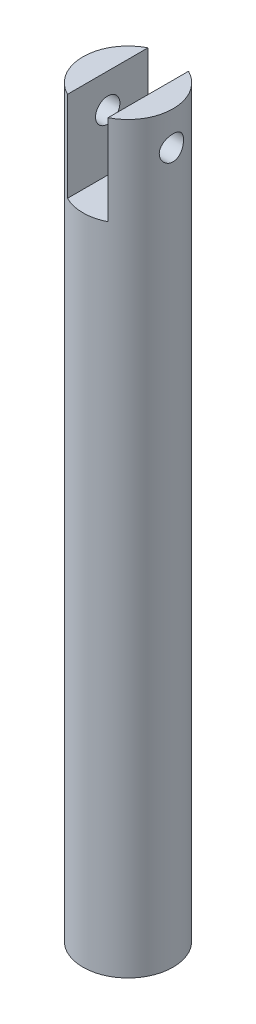
ISO-10303-21;
HEADER;
FILE_DESCRIPTION(('STEP AP214'),'2;1');
FILE_NAME('part.step','',(''),(''),'','','');
FILE_SCHEMA(('AUTOMOTIVE_DESIGN { 1 0 10303 214 1 1 1 1 }'));
ENDSEC;
DATA;
#1=APPLICATION_CONTEXT('core data for automotive mechanical design processes');
#2=APPLICATION_PROTOCOL_DEFINITION('international standard','automotive_design',2000,#1);
#3=PRODUCT_CONTEXT('',#1,'mechanical');
#4=PRODUCT('Part','Part','',(#3));
#5=PRODUCT_RELATED_PRODUCT_CATEGORY('part','',(#4));
#6=PRODUCT_DEFINITION_FORMATION('','',#4);
#7=PRODUCT_DEFINITION_CONTEXT('part definition',#1,'design');
#8=PRODUCT_DEFINITION('design','',#6,#7);
#9=PRODUCT_DEFINITION_SHAPE('','',#8);
#10=(LENGTH_UNIT() NAMED_UNIT(*) SI_UNIT(.MILLI.,.METRE.));
#11=(NAMED_UNIT(*) PLANE_ANGLE_UNIT() SI_UNIT($,.RADIAN.));
#12=(NAMED_UNIT(*) SI_UNIT($,.STERADIAN.) SOLID_ANGLE_UNIT());
#13=UNCERTAINTY_MEASURE_WITH_UNIT(LENGTH_MEASURE(1.E-05),#10,'distance_accuracy_value','');
#14=(GEOMETRIC_REPRESENTATION_CONTEXT(3) GLOBAL_UNCERTAINTY_ASSIGNED_CONTEXT((#13)) GLOBAL_UNIT_ASSIGNED_CONTEXT((#10,
#11,#12)) REPRESENTATION_CONTEXT('',''));
#15=CARTESIAN_POINT('',(0.,0.,0.));
#16=DIRECTION('',(0.,0.,1.));
#17=DIRECTION('',(1.,0.,0.));
#18=AXIS2_PLACEMENT_3D('',#15,#16,#17);
#19=CARTESIAN_POINT('',(0.,165.,0.));
#20=DIRECTION('',(0.,1.,0.));
#21=DIRECTION('',(0.,0.,1.));
#22=AXIS2_PLACEMENT_3D('',#19,#20,#21);
#23=PLANE('',#22);
#24=DIRECTION('',(0.,0.,-1.));
#25=VECTOR('',#24,1.);
#26=CARTESIAN_POINT('',(4.5,165.,0.));
#27=LINE('',#26,#25);
#28=CARTESIAN_POINT('',(4.5,165.,8.93028554974588));
#29=VERTEX_POINT('',#28);
#30=CARTESIAN_POINT('',(4.5,165.,-8.93028554974588));
#31=VERTEX_POINT('',#30);
#32=EDGE_CURVE('E68',#29,#31,#27,.T.);
#33=ORIENTED_EDGE('',*,*,#32,.F.);
#34=CARTESIAN_POINT('',(0.,165.,0.));
#35=DIRECTION('',(0.,1.,0.));
#36=DIRECTION('',(0.,0.,1.));
#37=AXIS2_PLACEMENT_3D('',#34,#35,#36);
#38=CIRCLE('',#37,10.);
#39=EDGE_CURVE('E124',#29,#31,#38,.T.);
#40=ORIENTED_EDGE('',*,*,#39,.T.);
#41=EDGE_LOOP('',(#33,#40));
#42=FACE_BOUND('',#41,.T.);
#43=ADVANCED_FACE('F38',(#42),#23,.T.);
#44=CARTESIAN_POINT('',(0.,165.,0.));
#45=DIRECTION('',(0.,-1.,0.));
#46=DIRECTION('',(0.,0.,-1.));
#47=AXIS2_PLACEMENT_3D('',#44,#45,#46);
#48=CYLINDRICAL_SURFACE('',#47,10.);
#49=CARTESIAN_POINT('',(-10.,154.8,0.));
#50=CARTESIAN_POINT('',(-9.99999782711062,154.800003386559,-0.148774661539189));
#51=CARTESIAN_POINT('',(-9.9966473286939,154.812337799472,-0.297585333539505));
#52=CARTESIAN_POINT('',(-9.9836070871437,154.861259427152,-0.590915377352122));
#53=CARTESIAN_POINT('',(-9.97391440506767,154.897857885885,-0.735432727183114));
#54=CARTESIAN_POINT('',(-9.94925888075004,154.99402760759,-1.0158999716253));
#55=CARTESIAN_POINT('',(-9.93430293083146,155.053568836318,-1.15186079795327));
#56=CARTESIAN_POINT('',(-9.90069893619965,155.193821453031,-1.41186713995326));
#57=CARTESIAN_POINT('',(-9.88205062098072,155.274534392213,-1.53591178164642));
#58=CARTESIAN_POINT('',(-9.84257839340819,155.456860153675,-1.77150674574477));
#59=CARTESIAN_POINT('',(-9.82171656406306,155.558881996826,-1.88273418059792));
#60=CARTESIAN_POINT('',(-9.78041033750172,155.78005544482,-2.08672685900315));
#61=CARTESIAN_POINT('',(-9.75996599578902,155.899209310591,-2.17948966190395));
#62=CARTESIAN_POINT('',(-9.72142045038815,156.153856412825,-2.34550594040794));
#63=CARTESIAN_POINT('',(-9.70336702035334,156.28960111161,-2.41838581893268));
#64=CARTESIAN_POINT('',(-9.67220575557493,156.571983500368,-2.54016030192197));
#65=CARTESIAN_POINT('',(-9.65909698346571,156.718619119419,-2.58905945297415));
#66=CARTESIAN_POINT('',(-9.6397010807165,157.015039944227,-2.66035893311824));
#67=CARTESIAN_POINT('',(-9.63326327331372,157.164674001672,-2.68334564996611));
#68=CARTESIAN_POINT('',(-9.6274882093643,157.465802406783,-2.70399621024263));
#69=CARTESIAN_POINT('',(-9.62814958985618,157.617296391786,-2.70166491443413));
#70=CARTESIAN_POINT('',(-9.63636343910677,157.913249730162,-2.67221068345233));
#71=CARTESIAN_POINT('',(-9.64371802942124,158.057786298388,-2.64579960378853));
#72=CARTESIAN_POINT('',(-9.66417246956971,158.340296488011,-2.57007659520705));
#73=CARTESIAN_POINT('',(-9.67727278885834,158.478269572117,-2.52076279500381));
#74=CARTESIAN_POINT('',(-9.70791505301908,158.745580817203,-2.40005953075999));
#75=CARTESIAN_POINT('',(-9.72550642491525,158.874801198981,-2.32842230940989));
#76=CARTESIAN_POINT('',(-9.76312239105775,159.119635831906,-2.16527848967669));
#77=CARTESIAN_POINT('',(-9.78314747476023,159.235247336868,-2.073767891536));
#78=CARTESIAN_POINT('',(-9.82419621962814,159.453646872194,-1.86984509586577));
#79=CARTESIAN_POINT('',(-9.84523086847348,159.555876080505,-1.7568357583884));
#80=CARTESIAN_POINT('',(-9.88532822784153,159.740047830832,-1.51501964000974));
#81=CARTESIAN_POINT('',(-9.90439085671031,159.821989533014,-1.38621220545104));
#82=CARTESIAN_POINT('',(-9.93851852041525,159.963514913375,-1.11557667636108));
#83=CARTESIAN_POINT('',(-9.95356499679829,160.022995305973,-0.973692076178258));
#84=CARTESIAN_POINT('',(-9.97783097942399,160.11709667255,-0.681437664338064));
#85=CARTESIAN_POINT('',(-9.98705179200694,160.151723219964,-0.531069763210365));
#86=CARTESIAN_POINT('',(-9.99842908447533,160.194251550347,-0.230884458265844));
#87=CARTESIAN_POINT('',(-10.000786274626,160.202912855267,-0.0811821027812173));
#88=CARTESIAN_POINT('',(-9.99874890418695,160.19536533025,0.21753690753403));
#89=CARTESIAN_POINT('',(-9.99435506036759,160.179159140544,0.366553633474505));
#90=CARTESIAN_POINT('',(-9.97943914885916,160.122958910074,0.656945682429493));
#91=CARTESIAN_POINT('',(-9.96902678125841,160.0833904254,0.798409517758602));
#92=CARTESIAN_POINT('',(-9.94325681392839,159.982084672722,1.07267627177578));
#93=CARTESIAN_POINT('',(-9.92789867156819,159.920344972094,1.20547823819418));
#94=CARTESIAN_POINT('',(-9.89347275386225,159.775053471939,1.46158793695578));
#95=CARTESIAN_POINT('',(-9.87433707216918,159.691091020193,1.5846533476921));
#96=CARTESIAN_POINT('',(-9.8345670726555,159.504251943255,1.81521391773308));
#97=CARTESIAN_POINT('',(-9.81393245162483,159.401371484791,1.92270591355773));
#98=CARTESIAN_POINT('',(-9.77274857958053,159.176069273472,2.12228305583065));
#99=CARTESIAN_POINT('',(-9.75221911203505,159.053167832728,2.2138317792438));
#100=CARTESIAN_POINT('',(-9.71422484892846,158.793310777353,2.37501987696983));
#101=CARTESIAN_POINT('',(-9.69675992824167,158.656355736893,2.44466014589861));
#102=CARTESIAN_POINT('',(-9.66707405627601,158.372946507826,2.55953142390198));
#103=CARTESIAN_POINT('',(-9.65482314679195,158.226552309027,2.60490227588316));
#104=CARTESIAN_POINT('',(-9.63695190227225,157.927823956503,2.67026743177152));
#105=CARTESIAN_POINT('',(-9.63132982056536,157.775491378452,2.69026842064778));
#106=CARTESIAN_POINT('',(-9.62750126828841,157.47470959402,2.70393453870695));
#107=CARTESIAN_POINT('',(-9.62905171428235,157.326302124101,2.69846291707097));
#108=CARTESIAN_POINT('',(-9.63882292855891,157.032610321882,2.663347108296));
#109=CARTESIAN_POINT('',(-9.64704351692299,156.88732590545,2.63370357316333));
#110=CARTESIAN_POINT('',(-9.66908223320172,156.605121496191,2.55159164235858));
#111=CARTESIAN_POINT('',(-9.68285437420306,156.468143170952,2.49931051009792));
#112=CARTESIAN_POINT('',(-9.7144445233644,156.204797630981,2.37355266173573));
#113=CARTESIAN_POINT('',(-9.7322631805526,156.078432122915,2.3000725449782));
#114=CARTESIAN_POINT('',(-9.77060877503339,155.83578947374,2.13140472742221));
#115=CARTESIAN_POINT('',(-9.79120110383606,155.719930655762,2.03563003127804));
#116=CARTESIAN_POINT('',(-9.83241350585107,155.505648810985,1.82620238877443));
#117=CARTESIAN_POINT('',(-9.85303358461553,155.407230053806,1.71254507727064));
#118=CARTESIAN_POINT('',(-9.89252319212526,155.228481134855,1.46754832216847));
#119=CARTESIAN_POINT('',(-9.9113439693372,155.148598743481,1.33587364656039));
#120=CARTESIAN_POINT('',(-9.94457675907837,155.012229021564,1.06045940918334));
#121=CARTESIAN_POINT('',(-9.95899152875418,154.955727052393,0.916727464560686));
#122=CARTESIAN_POINT('',(-9.97998045270278,154.87487709051,0.644659805995571));
#123=CARTESIAN_POINT('',(-9.98743240312409,154.846864379331,0.517468948295389));
#124=CARTESIAN_POINT('',(-9.99744287196379,154.809425321613,0.260194372540813));
#125=CARTESIAN_POINT('',(-10.0000019003015,154.799997038283,0.130110957365908));
#126=CARTESIAN_POINT('',(-10.,154.8,0.));
#127=B_SPLINE_CURVE_WITH_KNOTS('',3,(#49,#50,#51,#52,#53,#54,#55,#56,#57,#58,#59,#60,#61,#62,
#63,#64,#65,#66,#67,#68,#69,#70,#71,#72,#73,#74,#75,#76,#77,#78,#79,#80,#81,#82,#83,#84,#85,#86,
#87,#88,#89,#90,#91,#92,#93,#94,#95,#96,#97,#98,#99,#100,#101,#102,#103,#104,#105,#106,#107,
#108,#109,#110,#111,#112,#113,#114,#115,#116,#117,#118,#119,#120,#121,#122,#123,#124,#125,#126),
.UNSPECIFIED.,.T.,.F.,(4,2,2,2,2,2,2,2,2,2,2,2,2,2,2,2,2,2,2,2,2,2,2,2,2,2,2,2,2,2,2,2,2,2,2,2,
2,2,4),(0.,0.4458467616671,0.89190027339732,1.33737183210164,1.78287603849987,2.23788152875124,
2.69294712165628,3.15605180718671,3.61906865714873,4.07138297844436,4.52361046220639,
4.96288777079235,5.40220097720712,5.84657486439829,6.2910382702339,6.75038019248415,
7.20974112674612,7.67118937307156,8.13253410800253,8.58024533675495,9.02790903442276,
9.46765948757283,9.90745820485944,10.3560325750265,10.8046979382342,11.2663584986383,
11.7280002050195,12.1869524199219,12.6457836755925,13.089180858158,13.5325660810499,
13.9723515673493,14.4122076415362,14.8653077300239,15.3185185922744,15.7817442781461,
16.2446794950919,16.6346356533841,17.0245511699031),.UNSPECIFIED.);
#128=CARTESIAN_POINT('',(-10.,154.8,0.));
#129=VERTEX_POINT('',#128);
#130=EDGE_CURVE('E101',#129,#129,#127,.T.);
#131=ORIENTED_EDGE('',*,*,#130,.T.);
#132=EDGE_LOOP('',(#131));
#133=FACE_BOUND('',#132,.T.);
#134=CARTESIAN_POINT('',(9.62860322165162,157.5,-2.70000000000001));
#135=CARTESIAN_POINT('',(9.6286057280429,157.351336835201,-2.69999655900299));
#136=CARTESIAN_POINT('',(9.63208384696354,157.202637558112,-2.68767998648855));
#137=CARTESIAN_POINT('',(9.64557761207292,156.909538490372,-2.63883563352605));
#138=CARTESIAN_POINT('',(9.65559643086276,156.765140821798,-2.60229610347128));
#139=CARTESIAN_POINT('',(9.6809560194939,156.484927566899,-2.50629855598375));
#140=CARTESIAN_POINT('',(9.69628917493481,156.349100028633,-2.4468733158087));
#141=CARTESIAN_POINT('',(9.73054001291658,156.089319932487,-2.30689442210335));
#142=CARTESIAN_POINT('',(9.74945799945857,155.965368383058,-2.22633897646498));
#143=CARTESIAN_POINT('',(9.78929049159682,155.729680691704,-2.04417749563688));
#144=CARTESIAN_POINT('',(9.81024110105091,155.618294133831,-1.94212695493154));
#145=CARTESIAN_POINT('',(9.85146692605695,155.41399083801,-1.720827788983));
#146=CARTESIAN_POINT('',(9.87174206990631,155.321076055724,-1.60157734503675));
#147=CARTESIAN_POINT('',(9.90973607193501,155.154890362593,-1.34683342478799));
#148=CARTESIAN_POINT('',(9.92740737783171,155.081967841189,-1.21110496320858));
#149=CARTESIAN_POINT('',(9.95778787784737,154.960110180409,-0.928757102408092));
#150=CARTESIAN_POINT('',(9.97049793048538,154.911170890484,-0.782139592711362));
#151=CARTESIAN_POINT('',(9.98926854149535,154.839802725142,-0.485825353649318));
#152=CARTESIAN_POINT('',(9.99547806856363,154.816778982952,-0.336281502296952));
#153=CARTESIAN_POINT('',(10.0010691903509,154.796023018522,-0.0353335236431608));
#154=CARTESIAN_POINT('',(10.0004519555091,154.798286460829,0.116070280325717));
#155=CARTESIAN_POINT('',(9.9925678836156,154.827623566266,0.412296758741117));
#156=CARTESIAN_POINT('',(9.98547334585882,154.854054392749,0.557188384959518));
#157=CARTESIAN_POINT('',(9.96563570475151,154.929936371642,0.84039798252662));
#158=CARTESIAN_POINT('',(9.9528922753063,154.979388853036,0.978715573864246));
#159=CARTESIAN_POINT('',(9.92293481218154,155.100397485281,1.24648099930841));
#160=CARTESIAN_POINT('',(9.90567686412702,155.172172145261,1.3758249695454));
#161=CARTESIAN_POINT('',(9.86854715172272,155.335619553651,1.62085061906021));
#162=CARTESIAN_POINT('',(9.84867486715653,155.427296264659,1.73652957047251));
#163=CARTESIAN_POINT('',(9.80773009052841,155.631350650451,1.95477873759456));
#164=CARTESIAN_POINT('',(9.7866395077132,155.744288706712,2.05682224634866));
#165=CARTESIAN_POINT('',(9.74619743961254,155.98589184824,2.24065152284125));
#166=CARTESIAN_POINT('',(9.72684606600073,156.114557942145,2.32243599034944));
#167=CARTESIAN_POINT('',(9.6919994431629,156.385129829797,2.46384018569873));
#168=CARTESIAN_POINT('',(9.67652990962085,156.527115775674,2.52331333014262));
#169=CARTESIAN_POINT('',(9.65151627739817,156.819593761877,2.61737054010807));
#170=CARTESIAN_POINT('',(9.64197066671187,156.970083620981,2.65196095698713));
#171=CARTESIAN_POINT('',(9.63020874147968,157.270363270402,2.69435563413514));
#172=CARTESIAN_POINT('',(9.62777712765607,157.420033619409,2.70294701887154));
#173=CARTESIAN_POINT('',(9.62992885032024,157.718673033088,2.69527124881853));
#174=CARTESIAN_POINT('',(9.63451141883499,157.867642172743,2.67900681545819));
#175=CARTESIAN_POINT('',(9.64996687135091,158.157594459711,2.62277573652893));
#176=CARTESIAN_POINT('',(9.66071324235998,158.298677381942,2.58328540380536));
#177=CARTESIAN_POINT('',(9.68716114488267,158.572216330727,2.48226063960033));
#178=CARTESIAN_POINT('',(9.70286333541097,158.704671207112,2.42072327620295));
#179=CARTESIAN_POINT('',(9.73789319986385,158.960478616186,2.27576340488637));
#180=CARTESIAN_POINT('',(9.75729437915445,159.083559903449,2.19188041231183));
#181=CARTESIAN_POINT('',(9.79736473840698,159.314188352477,2.00517889062937));
#182=CARTESIAN_POINT('',(9.81803416243402,159.421732510785,1.90235670913284));
#183=CARTESIAN_POINT('',(9.85905567857819,159.62151790643,1.67704898471307));
#184=CARTESIAN_POINT('',(9.87938008232998,159.713209343837,1.55406986374836));
#185=CARTESIAN_POINT('',(9.91679230211157,159.874648660513,1.29401000390435));
#186=CARTESIAN_POINT('',(9.93388029044533,159.944397708106,1.156930016343));
#187=CARTESIAN_POINT('',(9.96278414626028,160.059326471535,0.873524562627499));
#188=CARTESIAN_POINT('',(9.97463943023666,160.104690458634,0.72727803866819));
#189=CARTESIAN_POINT('',(9.99191572025144,160.170091486393,0.428868767715208));
#190=CARTESIAN_POINT('',(9.99733819081505,160.190134291864,0.276707375478983));
#191=CARTESIAN_POINT('',(10.0010668069582,160.203955332069,-0.0240814786322249));
#192=CARTESIAN_POINT('',(9.99959121922956,160.19853910497,-0.172669738211618));
#193=CARTESIAN_POINT('',(9.99018510137762,160.163471464529,-0.466738310467977));
#194=CARTESIAN_POINT('',(9.98225482457425,160.133821002282,-0.612218744884311));
#195=CARTESIAN_POINT('',(9.96087560915395,160.051586578608,-0.894947223998435));
#196=CARTESIAN_POINT('',(9.94746691655142,159.999169692428,-1.03224710969827));
#197=CARTESIAN_POINT('',(9.91653117898034,159.873039286197,-1.29618147433337));
#198=CARTESIAN_POINT('',(9.89900354543022,159.799322722156,-1.4228144254864));
#199=CARTESIAN_POINT('',(9.86110732895719,159.630348350319,-1.66555568589808));
#200=CARTESIAN_POINT('',(9.84067443412776,159.534559105953,-1.78128398392585));
#201=CARTESIAN_POINT('',(9.79952523477207,159.325161482835,-1.99529608004692));
#202=CARTESIAN_POINT('',(9.77880885648649,159.21154838283,-2.0935752413979));
#203=CARTESIAN_POINT('',(9.73889546666951,158.966625366255,-2.27211177160667));
#204=CARTESIAN_POINT('',(9.71974362902075,158.834972228165,-2.35190931836916));
#205=CARTESIAN_POINT('',(9.68577259838324,158.559617534513,-2.48812579544668));
#206=CARTESIAN_POINT('',(9.67095064130863,158.415923741134,-2.54455965019283));
#207=CARTESIAN_POINT('',(9.64932074474974,158.14401855564,-2.6252729199288));
#208=CARTESIAN_POINT('',(9.64161548081269,158.016958256659,-2.65322876041464));
#209=CARTESIAN_POINT('',(9.63125592849245,157.759940939871,-2.69059268490396));
#210=CARTESIAN_POINT('',(9.62860103017769,157.629984273776,-2.70000300865046));
#211=CARTESIAN_POINT('',(9.62860322165162,157.5,-2.70000000000001));
#212=B_SPLINE_CURVE_WITH_KNOTS('',3,(#134,#135,#136,#137,#138,#139,#140,#141,#142,#143,#144,
#145,#146,#147,#148,#149,#150,#151,#152,#153,#154,#155,#156,#157,#158,#159,#160,#161,#162,#163,
#164,#165,#166,#167,#168,#169,#170,#171,#172,#173,#174,#175,#176,#177,#178,#179,#180,#181,#182,
#183,#184,#185,#186,#187,#188,#189,#190,#191,#192,#193,#194,#195,#196,#197,#198,#199,#200,#201,
#202,#203,#204,#205,#206,#207,#208,#209,#210,#211),.UNSPECIFIED.,.T.,.F.,(4,2,2,2,2,2,2,2,2,2,2,
2,2,2,2,2,2,2,2,2,2,2,2,2,2,2,2,2,2,2,2,2,2,2,2,2,2,2,4),(0.,0.445511384686915,
0.891239027749212,1.33633065289988,1.78146003964979,2.23690331739994,2.69239478868559,
3.15538119713909,3.61828745265076,4.07033646532584,4.52230797599975,4.96259638653628,
5.40291021699995,5.84767761642819,6.2925336525938,6.75138082306013,7.21025743482634,
7.67209811645267,8.13382087060837,8.58141758197617,9.02896529011132,9.46763992251741,
9.90637291356798,10.3549595477224,10.8036327817508,11.2656407018903,11.7276240182065,
12.1860653429292,12.644402276656,13.0883365786915,13.5322534589779,13.9729662142242,
14.4137419840425,14.8665081924962,15.3193945345948,15.7825631115304,16.2454353640164,
16.6350172007772,17.0245519848356),.UNSPECIFIED.);
#213=CARTESIAN_POINT('',(9.62860322165162,157.5,-2.70000000000001));
#214=VERTEX_POINT('',#213);
#215=EDGE_CURVE('E142',#214,#214,#212,.T.);
#216=ORIENTED_EDGE('',*,*,#215,.T.);
#217=EDGE_LOOP('',(#216));
#218=FACE_BOUND('',#217,.T.);
#219=CARTESIAN_POINT('',(0.,145.,0.));
#220=DIRECTION('',(0.,-1.,0.));
#221=DIRECTION('',(0.,0.,-1.));
#222=AXIS2_PLACEMENT_3D('',#219,#220,#221);
#223=CIRCLE('',#222,10.);
#224=CARTESIAN_POINT('',(-4.5,145.,-8.93028554974588));
#225=VERTEX_POINT('',#224);
#226=CARTESIAN_POINT('',(4.5,145.,-8.93028554974588));
#227=VERTEX_POINT('',#226);
#228=EDGE_CURVE('E11',#225,#227,#223,.T.);
#229=ORIENTED_EDGE('',*,*,#228,.T.);
#230=DIRECTION('',(0.,-1.,0.));
#231=VECTOR('',#230,1.);
#232=CARTESIAN_POINT('',(4.5,165.,-8.93028554974588));
#233=LINE('',#232,#231);
#234=EDGE_CURVE('E108',#227,#31,#233,.F.);
#235=ORIENTED_EDGE('',*,*,#234,.T.);
#236=ORIENTED_EDGE('',*,*,#39,.F.);
#237=DIRECTION('',(0.,-1.,0.));
#238=VECTOR('',#237,1.);
#239=CARTESIAN_POINT('',(4.5,165.,8.93028554974588));
#240=LINE('',#239,#238);
#241=CARTESIAN_POINT('',(4.5,145.,8.93028554974588));
#242=VERTEX_POINT('',#241);
#243=EDGE_CURVE('E113',#29,#242,#240,.T.);
#244=ORIENTED_EDGE('',*,*,#243,.T.);
#245=CARTESIAN_POINT('',(-4.5,145.,8.93028554974588));
#246=VERTEX_POINT('',#245);
#247=EDGE_CURVE('E49',#242,#246,#223,.T.);
#248=ORIENTED_EDGE('',*,*,#247,.T.);
#249=DIRECTION('',(0.,-1.,0.));
#250=VECTOR('',#249,1.);
#251=CARTESIAN_POINT('',(-4.5,165.,8.93028554974588));
#252=LINE('',#251,#250);
#253=CARTESIAN_POINT('',(-4.5,165.,8.93028554974588));
#254=VERTEX_POINT('',#253);
#255=EDGE_CURVE('E99',#246,#254,#252,.F.);
#256=ORIENTED_EDGE('',*,*,#255,.T.);
#257=CARTESIAN_POINT('',(-4.5,165.,-8.93028554974588));
#258=VERTEX_POINT('',#257);
#259=EDGE_CURVE('E106',#258,#254,#38,.T.);
#260=ORIENTED_EDGE('',*,*,#259,.F.);
#261=DIRECTION('',(0.,-1.,0.));
#262=VECTOR('',#261,1.);
#263=CARTESIAN_POINT('',(-4.5,165.,-8.93028554974588));
#264=LINE('',#263,#262);
#265=EDGE_CURVE('E59',#258,#225,#264,.T.);
#266=ORIENTED_EDGE('',*,*,#265,.T.);
#267=EDGE_LOOP('',(#229,#235,#236,#244,#248,#256,#260,#266));
#268=FACE_BOUND('',#267,.T.);
#269=CARTESIAN_POINT('',(0.,0.,0.));
#270=DIRECTION('',(0.,1.,0.));
#271=DIRECTION('',(0.,0.,1.));
#272=AXIS2_PLACEMENT_3D('',#269,#270,#271);
#273=CIRCLE('',#272,10.);
#274=CARTESIAN_POINT('',(0.,0.,10.));
#275=VERTEX_POINT('',#274);
#276=EDGE_CURVE('E121',#275,#275,#273,.T.);
#277=ORIENTED_EDGE('',*,*,#276,.T.);
#278=EDGE_LOOP('',(#277));
#279=FACE_BOUND('',#278,.T.);
#280=ADVANCED_FACE('F40',(#133,#218,#268,#279),#48,.T.);
#281=DIRECTION('',(0.,0.,1.));
#282=VECTOR('',#281,1.);
#283=CARTESIAN_POINT('',(-4.5,165.,0.));
#284=LINE('',#283,#282);
#285=EDGE_CURVE('E127',#258,#254,#284,.T.);
#286=ORIENTED_EDGE('',*,*,#285,.F.);
#287=ORIENTED_EDGE('',*,*,#259,.T.);
#288=EDGE_LOOP('',(#286,#287));
#289=FACE_BOUND('',#288,.T.);
#290=ADVANCED_FACE('F163',(#289),#23,.T.);
#291=CARTESIAN_POINT('',(0.,0.,0.));
#292=DIRECTION('',(0.,1.,0.));
#293=DIRECTION('',(0.,0.,1.));
#294=AXIS2_PLACEMENT_3D('',#291,#292,#293);
#295=PLANE('',#294);
#296=ORIENTED_EDGE('',*,*,#276,.F.);
#297=EDGE_LOOP('',(#296));
#298=FACE_BOUND('',#297,.T.);
#299=ADVANCED_FACE('F156',(#298),#295,.F.);
#300=CARTESIAN_POINT('',(-4.5,145.,-10.));
#301=DIRECTION('',(0.,-1.,0.));
#302=DIRECTION('',(0.,0.,-1.));
#303=AXIS2_PLACEMENT_3D('',#300,#301,#302);
#304=PLANE('',#303);
#305=DIRECTION('',(0.,0.,1.));
#306=VECTOR('',#305,1.);
#307=CARTESIAN_POINT('',(4.5,145.,-10.));
#308=LINE('',#307,#306);
#309=EDGE_CURVE('E95',#227,#242,#308,.T.);
#310=ORIENTED_EDGE('',*,*,#309,.F.);
#311=ORIENTED_EDGE('',*,*,#228,.F.);
#312=DIRECTION('',(0.,0.,1.));
#313=VECTOR('',#312,1.);
#314=CARTESIAN_POINT('',(-4.5,145.,-10.));
#315=LINE('',#314,#313);
#316=EDGE_CURVE('E92',#225,#246,#315,.T.);
#317=ORIENTED_EDGE('',*,*,#316,.T.);
#318=ORIENTED_EDGE('',*,*,#247,.F.);
#319=EDGE_LOOP('',(#310,#311,#317,#318));
#320=FACE_BOUND('',#319,.T.);
#321=ADVANCED_FACE('F91',(#320),#304,.F.);
#322=CARTESIAN_POINT('',(4.5,185.,-10.));
#323=DIRECTION('',(1.,0.,0.));
#324=DIRECTION('',(0.,0.,-1.));
#325=AXIS2_PLACEMENT_3D('',#322,#323,#324);
#326=PLANE('',#325);
#327=CARTESIAN_POINT('',(4.5,157.5,0.));
#328=DIRECTION('',(1.,0.,0.));
#329=DIRECTION('',(0.,0.,-1.));
#330=AXIS2_PLACEMENT_3D('',#327,#328,#329);
#331=CIRCLE('',#330,2.70000000000001);
#332=CARTESIAN_POINT('',(4.5,157.5,-2.70000000000001));
#333=VERTEX_POINT('',#332);
#334=EDGE_CURVE('E181',#333,#333,#331,.T.);
#335=ORIENTED_EDGE('',*,*,#334,.T.);
#336=EDGE_LOOP('',(#335));
#337=FACE_BOUND('',#336,.T.);
#338=ORIENTED_EDGE('',*,*,#32,.T.);
#339=ORIENTED_EDGE('',*,*,#234,.F.);
#340=ORIENTED_EDGE('',*,*,#309,.T.);
#341=ORIENTED_EDGE('',*,*,#243,.F.);
#342=EDGE_LOOP('',(#338,#339,#340,#341));
#343=FACE_BOUND('',#342,.T.);
#344=ADVANCED_FACE('F133',(#337,#343),#326,.F.);
#345=CARTESIAN_POINT('',(-4.5,185.,-10.));
#346=DIRECTION('',(-1.,0.,0.));
#347=DIRECTION('',(0.,0.,1.));
#348=AXIS2_PLACEMENT_3D('',#345,#346,#347);
#349=PLANE('',#348);
#350=CARTESIAN_POINT('',(-4.5,157.5,0.));
#351=DIRECTION('',(-1.,0.,0.));
#352=DIRECTION('',(0.,0.,1.));
#353=AXIS2_PLACEMENT_3D('',#350,#351,#352);
#354=CIRCLE('',#353,2.70000000000001);
#355=CARTESIAN_POINT('',(-4.5,157.5,2.70000000000001));
#356=VERTEX_POINT('',#355);
#357=EDGE_CURVE('E43',#356,#356,#354,.T.);
#358=ORIENTED_EDGE('',*,*,#357,.T.);
#359=EDGE_LOOP('',(#358));
#360=FACE_BOUND('',#359,.T.);
#361=ORIENTED_EDGE('',*,*,#285,.T.);
#362=ORIENTED_EDGE('',*,*,#255,.F.);
#363=ORIENTED_EDGE('',*,*,#316,.F.);
#364=ORIENTED_EDGE('',*,*,#265,.F.);
#365=EDGE_LOOP('',(#361,#362,#363,#364));
#366=FACE_BOUND('',#365,.T.);
#367=ADVANCED_FACE('F97',(#360,#366),#349,.F.);
#368=CARTESIAN_POINT('',(-10.,157.5,0.));
#369=DIRECTION('',(1.,0.,0.));
#370=DIRECTION('',(0.,0.,-1.));
#371=AXIS2_PLACEMENT_3D('',#368,#369,#370);
#372=CYLINDRICAL_SURFACE('',#371,2.70000000000001);
#373=ORIENTED_EDGE('',*,*,#357,.F.);
#374=EDGE_LOOP('',(#373));
#375=FACE_BOUND('',#374,.T.);
#376=ORIENTED_EDGE('',*,*,#130,.F.);
#377=EDGE_LOOP('',(#376));
#378=FACE_BOUND('',#377,.T.);
#379=ADVANCED_FACE('F147',(#375,#378),#372,.F.);
#380=ORIENTED_EDGE('',*,*,#334,.F.);
#381=EDGE_LOOP('',(#380));
#382=FACE_BOUND('',#381,.T.);
#383=ORIENTED_EDGE('',*,*,#215,.F.);
#384=EDGE_LOOP('',(#383));
#385=FACE_BOUND('',#384,.T.);
#386=ADVANCED_FACE('F151',(#382,#385),#372,.F.);
#387=CLOSED_SHELL('',(#43,#280,#290,#299,#321,#344,#367,#379,#386));
#388=MANIFOLD_SOLID_BREP('B2',#387);
#389=ADVANCED_BREP_SHAPE_REPRESENTATION('',(#18,#388),#14);
#390=SHAPE_DEFINITION_REPRESENTATION(#9,#389);
ENDSEC;
END-ISO-10303-21;
